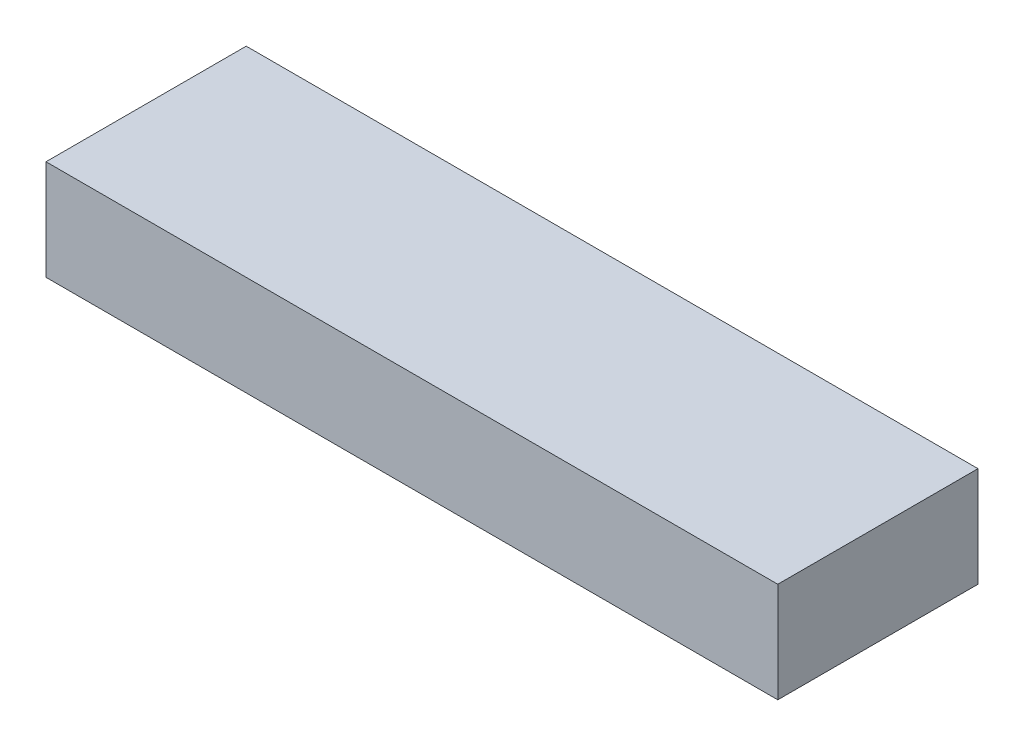
ISO-10303-21;
HEADER;
FILE_DESCRIPTION(('STEP AP214'),'2;1');
FILE_NAME('part.step','',(''),(''),'','','');
FILE_SCHEMA(('AUTOMOTIVE_DESIGN { 1 0 10303 214 1 1 1 1 }'));
ENDSEC;
DATA;
#1=APPLICATION_CONTEXT('core data for automotive mechanical design processes');
#2=APPLICATION_PROTOCOL_DEFINITION('international standard','automotive_design',2000,#1);
#3=PRODUCT_CONTEXT('',#1,'mechanical');
#4=PRODUCT('Part','Part','',(#3));
#5=PRODUCT_RELATED_PRODUCT_CATEGORY('part','',(#4));
#6=PRODUCT_DEFINITION_FORMATION('','',#4);
#7=PRODUCT_DEFINITION_CONTEXT('part definition',#1,'design');
#8=PRODUCT_DEFINITION('design','',#6,#7);
#9=PRODUCT_DEFINITION_SHAPE('','',#8);
#10=(LENGTH_UNIT() NAMED_UNIT(*) SI_UNIT(.MILLI.,.METRE.));
#11=(NAMED_UNIT(*) PLANE_ANGLE_UNIT() SI_UNIT($,.RADIAN.));
#12=(NAMED_UNIT(*) SI_UNIT($,.STERADIAN.) SOLID_ANGLE_UNIT());
#13=UNCERTAINTY_MEASURE_WITH_UNIT(LENGTH_MEASURE(1.E-05),#10,'distance_accuracy_value','');
#14=(GEOMETRIC_REPRESENTATION_CONTEXT(3) GLOBAL_UNCERTAINTY_ASSIGNED_CONTEXT((#13)) GLOBAL_UNIT_ASSIGNED_CONTEXT((#10,
#11,#12)) REPRESENTATION_CONTEXT('',''));
#15=CARTESIAN_POINT('',(0.,0.,0.));
#16=DIRECTION('',(0.,0.,1.));
#17=DIRECTION('',(1.,0.,0.));
#18=AXIS2_PLACEMENT_3D('',#15,#16,#17);
#19=CARTESIAN_POINT('',(0.,-10.,0.));
#20=DIRECTION('',(-1.,0.,0.));
#21=DIRECTION('',(0.,0.,1.));
#22=AXIS2_PLACEMENT_3D('',#19,#20,#21);
#23=PLANE('',#22);
#24=DIRECTION('',(0.,0.,1.));
#25=VECTOR('',#24,1.);
#26=CARTESIAN_POINT('',(0.,0.,0.));
#27=LINE('',#26,#25);
#28=CARTESIAN_POINT('',(0.,0.,-20.));
#29=VERTEX_POINT('',#28);
#30=CARTESIAN_POINT('',(0.,0.,0.));
#31=VERTEX_POINT('',#30);
#32=EDGE_CURVE('E107',#29,#31,#27,.T.);
#33=ORIENTED_EDGE('',*,*,#32,.F.);
#34=DIRECTION('',(0.,1.,0.));
#35=VECTOR('',#34,1.);
#36=CARTESIAN_POINT('',(0.,-10.,-20.));
#37=LINE('',#36,#35);
#38=CARTESIAN_POINT('',(0.,-10.,-20.));
#39=VERTEX_POINT('',#38);
#40=EDGE_CURVE('E11',#39,#29,#37,.T.);
#41=ORIENTED_EDGE('',*,*,#40,.F.);
#42=DIRECTION('',(0.,0.,1.));
#43=VECTOR('',#42,1.);
#44=CARTESIAN_POINT('',(0.,-10.,0.));
#45=LINE('',#44,#43);
#46=CARTESIAN_POINT('',(0.,-10.,0.));
#47=VERTEX_POINT('',#46);
#48=EDGE_CURVE('E102',#39,#47,#45,.T.);
#49=ORIENTED_EDGE('',*,*,#48,.T.);
#50=DIRECTION('',(0.,1.,0.));
#51=VECTOR('',#50,1.);
#52=CARTESIAN_POINT('',(0.,-10.,0.));
#53=LINE('',#52,#51);
#54=EDGE_CURVE('E46',#47,#31,#53,.T.);
#55=ORIENTED_EDGE('',*,*,#54,.T.);
#56=EDGE_LOOP('',(#33,#41,#49,#55));
#57=FACE_BOUND('',#56,.T.);
#58=ADVANCED_FACE('F43',(#57),#23,.T.);
#59=CARTESIAN_POINT('',(0.,-10.,-20.));
#60=DIRECTION('',(0.,0.,-1.));
#61=DIRECTION('',(-1.,0.,0.));
#62=AXIS2_PLACEMENT_3D('',#59,#60,#61);
#63=PLANE('',#62);
#64=DIRECTION('',(-1.,0.,0.));
#65=VECTOR('',#64,1.);
#66=CARTESIAN_POINT('',(0.,0.,-20.));
#67=LINE('',#66,#65);
#68=CARTESIAN_POINT('',(73.1,0.,-20.));
#69=VERTEX_POINT('',#68);
#70=EDGE_CURVE('E104',#69,#29,#67,.T.);
#71=ORIENTED_EDGE('',*,*,#70,.F.);
#72=DIRECTION('',(0.,1.,0.));
#73=VECTOR('',#72,1.);
#74=CARTESIAN_POINT('',(73.1,-10.,-20.));
#75=LINE('',#74,#73);
#76=CARTESIAN_POINT('',(73.1,-10.,-20.));
#77=VERTEX_POINT('',#76);
#78=EDGE_CURVE('E55',#77,#69,#75,.T.);
#79=ORIENTED_EDGE('',*,*,#78,.F.);
#80=DIRECTION('',(-1.,0.,0.));
#81=VECTOR('',#80,1.);
#82=CARTESIAN_POINT('',(0.,-10.,-20.));
#83=LINE('',#82,#81);
#84=EDGE_CURVE('E97',#77,#39,#83,.T.);
#85=ORIENTED_EDGE('',*,*,#84,.T.);
#86=ORIENTED_EDGE('',*,*,#40,.T.);
#87=EDGE_LOOP('',(#71,#79,#85,#86));
#88=FACE_BOUND('',#87,.T.);
#89=ADVANCED_FACE('F117',(#88),#63,.T.);
#90=CARTESIAN_POINT('',(73.1,-10.,0.));
#91=DIRECTION('',(1.,0.,0.));
#92=DIRECTION('',(0.,0.,-1.));
#93=AXIS2_PLACEMENT_3D('',#90,#91,#92);
#94=PLANE('',#93);
#95=DIRECTION('',(0.,0.,-1.));
#96=VECTOR('',#95,1.);
#97=CARTESIAN_POINT('',(73.1,0.,0.));
#98=LINE('',#97,#96);
#99=CARTESIAN_POINT('',(73.1,0.,0.));
#100=VERTEX_POINT('',#99);
#101=EDGE_CURVE('E93',#100,#69,#98,.T.);
#102=ORIENTED_EDGE('',*,*,#101,.F.);
#103=DIRECTION('',(0.,1.,0.));
#104=VECTOR('',#103,1.);
#105=CARTESIAN_POINT('',(73.1,-10.,0.));
#106=LINE('',#105,#104);
#107=CARTESIAN_POINT('',(73.1,-10.,0.));
#108=VERTEX_POINT('',#107);
#109=EDGE_CURVE('E88',#108,#100,#106,.T.);
#110=ORIENTED_EDGE('',*,*,#109,.F.);
#111=DIRECTION('',(0.,0.,-1.));
#112=VECTOR('',#111,1.);
#113=CARTESIAN_POINT('',(73.1,-10.,0.));
#114=LINE('',#113,#112);
#115=EDGE_CURVE('E91',#108,#77,#114,.T.);
#116=ORIENTED_EDGE('',*,*,#115,.T.);
#117=ORIENTED_EDGE('',*,*,#78,.T.);
#118=EDGE_LOOP('',(#102,#110,#116,#117));
#119=FACE_BOUND('',#118,.T.);
#120=ADVANCED_FACE('F89',(#119),#94,.T.);
#121=CARTESIAN_POINT('',(0.,-10.,0.));
#122=DIRECTION('',(0.,0.,1.));
#123=DIRECTION('',(1.,0.,0.));
#124=AXIS2_PLACEMENT_3D('',#121,#122,#123);
#125=PLANE('',#124);
#126=DIRECTION('',(1.,0.,0.));
#127=VECTOR('',#126,1.);
#128=CARTESIAN_POINT('',(0.,0.,0.));
#129=LINE('',#128,#127);
#130=EDGE_CURVE('E110',#31,#100,#129,.T.);
#131=ORIENTED_EDGE('',*,*,#130,.F.);
#132=ORIENTED_EDGE('',*,*,#54,.F.);
#133=DIRECTION('',(1.,0.,0.));
#134=VECTOR('',#133,1.);
#135=CARTESIAN_POINT('',(0.,-10.,0.));
#136=LINE('',#135,#134);
#137=EDGE_CURVE('E100',#47,#108,#136,.T.);
#138=ORIENTED_EDGE('',*,*,#137,.T.);
#139=ORIENTED_EDGE('',*,*,#109,.T.);
#140=EDGE_LOOP('',(#131,#132,#138,#139));
#141=FACE_BOUND('',#140,.T.);
#142=ADVANCED_FACE('F99',(#141),#125,.T.);
#143=CARTESIAN_POINT('',(0.,-10.,0.));
#144=DIRECTION('',(0.,-1.,0.));
#145=DIRECTION('',(0.,0.,-1.));
#146=AXIS2_PLACEMENT_3D('',#143,#144,#145);
#147=PLANE('',#146);
#148=ORIENTED_EDGE('',*,*,#48,.F.);
#149=ORIENTED_EDGE('',*,*,#84,.F.);
#150=ORIENTED_EDGE('',*,*,#115,.F.);
#151=ORIENTED_EDGE('',*,*,#137,.F.);
#152=EDGE_LOOP('',(#148,#149,#150,#151));
#153=FACE_BOUND('',#152,.T.);
#154=ADVANCED_FACE('F96',(#153),#147,.T.);
#155=CARTESIAN_POINT('',(0.,0.,0.));
#156=DIRECTION('',(0.,-1.,0.));
#157=DIRECTION('',(0.,0.,-1.));
#158=AXIS2_PLACEMENT_3D('',#155,#156,#157);
#159=PLANE('',#158);
#160=ORIENTED_EDGE('',*,*,#32,.T.);
#161=ORIENTED_EDGE('',*,*,#130,.T.);
#162=ORIENTED_EDGE('',*,*,#101,.T.);
#163=ORIENTED_EDGE('',*,*,#70,.T.);
#164=EDGE_LOOP('',(#160,#161,#162,#163));
#165=FACE_BOUND('',#164,.T.);
#166=ADVANCED_FACE('F116',(#165),#159,.F.);
#167=CLOSED_SHELL('',(#58,#89,#120,#142,#154,#166));
#168=MANIFOLD_SOLID_BREP('B2',#167);
#169=ADVANCED_BREP_SHAPE_REPRESENTATION('',(#18,#168),#14);
#170=SHAPE_DEFINITION_REPRESENTATION(#9,#169);
ENDSEC;
END-ISO-10303-21;
